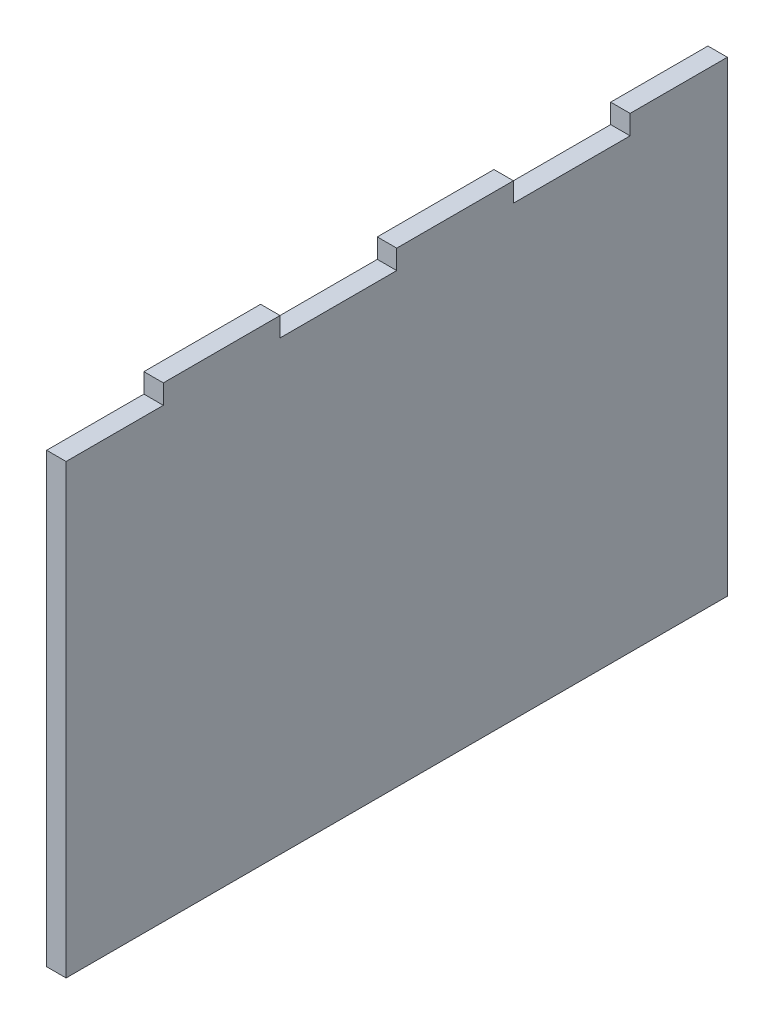
ISO-10303-21;
HEADER;
FILE_DESCRIPTION(('STEP AP214'),'2;1');
FILE_NAME('part.step','',(''),(''),'','','');
FILE_SCHEMA(('AUTOMOTIVE_DESIGN { 1 0 10303 214 1 1 1 1 }'));
ENDSEC;
DATA;
#1=APPLICATION_CONTEXT('core data for automotive mechanical design processes');
#2=APPLICATION_PROTOCOL_DEFINITION('international standard','automotive_design',2000,#1);
#3=PRODUCT_CONTEXT('',#1,'mechanical');
#4=PRODUCT('Part','Part','',(#3));
#5=PRODUCT_RELATED_PRODUCT_CATEGORY('part','',(#4));
#6=PRODUCT_DEFINITION_FORMATION('','',#4);
#7=PRODUCT_DEFINITION_CONTEXT('part definition',#1,'design');
#8=PRODUCT_DEFINITION('design','',#6,#7);
#9=PRODUCT_DEFINITION_SHAPE('','',#8);
#10=(LENGTH_UNIT() NAMED_UNIT(*) SI_UNIT(.MILLI.,.METRE.));
#11=(NAMED_UNIT(*) PLANE_ANGLE_UNIT() SI_UNIT($,.RADIAN.));
#12=(NAMED_UNIT(*) SI_UNIT($,.STERADIAN.) SOLID_ANGLE_UNIT());
#13=UNCERTAINTY_MEASURE_WITH_UNIT(LENGTH_MEASURE(1.E-05),#10,'distance_accuracy_value','');
#14=(GEOMETRIC_REPRESENTATION_CONTEXT(3) GLOBAL_UNCERTAINTY_ASSIGNED_CONTEXT((#13)) GLOBAL_UNIT_ASSIGNED_CONTEXT((#10,
#11,#12)) REPRESENTATION_CONTEXT('',''));
#15=CARTESIAN_POINT('',(0.,0.,0.));
#16=DIRECTION('',(0.,0.,1.));
#17=DIRECTION('',(1.,0.,0.));
#18=AXIS2_PLACEMENT_3D('',#15,#16,#17);
#19=CARTESIAN_POINT('',(12.7,152.4,-215.9));
#20=DIRECTION('',(0.,-1.,0.));
#21=DIRECTION('',(0.,0.,-1.));
#22=AXIS2_PLACEMENT_3D('',#19,#20,#21);
#23=PLANE('',#22);
#24=DIRECTION('',(0.,0.,1.));
#25=VECTOR('',#24,1.);
#26=CARTESIAN_POINT('',(12.7,152.4,-215.9));
#27=LINE('',#26,#25);
#28=CARTESIAN_POINT('',(12.7,152.4,-76.2));
#29=VERTEX_POINT('',#28);
#30=CARTESIAN_POINT('',(12.7,152.4,0.));
#31=VERTEX_POINT('',#30);
#32=EDGE_CURVE('E228',#29,#31,#27,.T.);
#33=ORIENTED_EDGE('',*,*,#32,.F.);
#34=DIRECTION('',(1.,0.,0.));
#35=VECTOR('',#34,1.);
#36=CARTESIAN_POINT('',(0.,152.4,-76.2));
#37=LINE('',#36,#35);
#38=CARTESIAN_POINT('',(0.,152.4,-76.2));
#39=VERTEX_POINT('',#38);
#40=EDGE_CURVE('E164',#39,#29,#37,.T.);
#41=ORIENTED_EDGE('',*,*,#40,.F.);
#42=DIRECTION('',(0.,0.,1.));
#43=VECTOR('',#42,1.);
#44=CARTESIAN_POINT('',(0.,152.4,-215.9));
#45=LINE('',#44,#43);
#46=CARTESIAN_POINT('',(0.,152.4,0.));
#47=VERTEX_POINT('',#46);
#48=EDGE_CURVE('E155',#39,#47,#45,.T.);
#49=ORIENTED_EDGE('',*,*,#48,.T.);
#50=DIRECTION('',(1.,0.,0.));
#51=VECTOR('',#50,1.);
#52=CARTESIAN_POINT('',(0.,152.4,0.));
#53=LINE('',#52,#51);
#54=EDGE_CURVE('E190',#47,#31,#53,.T.);
#55=ORIENTED_EDGE('',*,*,#54,.T.);
#56=EDGE_LOOP('',(#33,#41,#49,#55));
#57=FACE_BOUND('',#56,.T.);
#58=ADVANCED_FACE('F33',(#57),#23,.F.);
#59=CARTESIAN_POINT('',(12.7,152.4,76.2));
#60=VERTEX_POINT('',#59);
#61=CARTESIAN_POINT('',(12.7,152.4,152.4));
#62=VERTEX_POINT('',#61);
#63=EDGE_CURVE('E224',#60,#62,#27,.T.);
#64=ORIENTED_EDGE('',*,*,#63,.F.);
#65=DIRECTION('',(1.,0.,0.));
#66=VECTOR('',#65,1.);
#67=CARTESIAN_POINT('',(0.,152.4,76.2));
#68=LINE('',#67,#66);
#69=CARTESIAN_POINT('',(0.,152.4,76.2));
#70=VERTEX_POINT('',#69);
#71=EDGE_CURVE('E187',#70,#60,#68,.T.);
#72=ORIENTED_EDGE('',*,*,#71,.F.);
#73=CARTESIAN_POINT('',(0.,152.4,152.4));
#74=VERTEX_POINT('',#73);
#75=EDGE_CURVE('E236',#70,#74,#45,.T.);
#76=ORIENTED_EDGE('',*,*,#75,.T.);
#77=DIRECTION('',(1.,0.,0.));
#78=VECTOR('',#77,1.);
#79=CARTESIAN_POINT('',(0.,152.4,152.4));
#80=LINE('',#79,#78);
#81=EDGE_CURVE('E211',#74,#62,#80,.T.);
#82=ORIENTED_EDGE('',*,*,#81,.T.);
#83=EDGE_LOOP('',(#64,#72,#76,#82));
#84=FACE_BOUND('',#83,.T.);
#85=ADVANCED_FACE('F270',(#84),#23,.F.);
#86=CARTESIAN_POINT('',(12.7,152.4,-215.9));
#87=DIRECTION('',(0.,0.,-1.));
#88=DIRECTION('',(0.,1.,0.));
#89=AXIS2_PLACEMENT_3D('',#86,#87,#88);
#90=PLANE('',#89);
#91=DIRECTION('',(0.,-1.,0.));
#92=VECTOR('',#91,1.);
#93=CARTESIAN_POINT('',(0.,152.4,-215.9));
#94=LINE('',#93,#92);
#95=CARTESIAN_POINT('',(0.,152.4,-215.9));
#96=VERTEX_POINT('',#95);
#97=CARTESIAN_POINT('',(0.,-152.4,-215.9));
#98=VERTEX_POINT('',#97);
#99=EDGE_CURVE('E210',#96,#98,#94,.T.);
#100=ORIENTED_EDGE('',*,*,#99,.F.);
#101=DIRECTION('',(-1.,0.,0.));
#102=VECTOR('',#101,1.);
#103=CARTESIAN_POINT('',(12.7,152.4,-215.9));
#104=LINE('',#103,#102);
#105=CARTESIAN_POINT('',(12.7,152.4,-215.9));
#106=VERTEX_POINT('',#105);
#107=EDGE_CURVE('E11',#106,#96,#104,.T.);
#108=ORIENTED_EDGE('',*,*,#107,.F.);
#109=DIRECTION('',(0.,-1.,0.));
#110=VECTOR('',#109,1.);
#111=CARTESIAN_POINT('',(12.7,152.4,-215.9));
#112=LINE('',#111,#110);
#113=CARTESIAN_POINT('',(12.7,-152.4,-215.9));
#114=VERTEX_POINT('',#113);
#115=EDGE_CURVE('E215',#106,#114,#112,.T.);
#116=ORIENTED_EDGE('',*,*,#115,.T.);
#117=DIRECTION('',(-1.,0.,0.));
#118=VECTOR('',#117,1.);
#119=CARTESIAN_POINT('',(12.7,-152.4,-215.9));
#120=LINE('',#119,#118);
#121=EDGE_CURVE('E37',#114,#98,#120,.T.);
#122=ORIENTED_EDGE('',*,*,#121,.T.);
#123=EDGE_LOOP('',(#100,#108,#116,#122));
#124=FACE_BOUND('',#123,.T.);
#125=ADVANCED_FACE('F35',(#124),#90,.T.);
#126=CARTESIAN_POINT('',(0.,152.4,-152.4));
#127=VERTEX_POINT('',#126);
#128=EDGE_CURVE('E219',#96,#127,#45,.T.);
#129=ORIENTED_EDGE('',*,*,#128,.T.);
#130=DIRECTION('',(1.,0.,0.));
#131=VECTOR('',#130,1.);
#132=CARTESIAN_POINT('',(0.,152.4,-152.4));
#133=LINE('',#132,#131);
#134=CARTESIAN_POINT('',(12.7,152.4,-152.4));
#135=VERTEX_POINT('',#134);
#136=EDGE_CURVE('E167',#127,#135,#133,.T.);
#137=ORIENTED_EDGE('',*,*,#136,.T.);
#138=EDGE_CURVE('E225',#106,#135,#27,.T.);
#139=ORIENTED_EDGE('',*,*,#138,.F.);
#140=ORIENTED_EDGE('',*,*,#107,.T.);
#141=EDGE_LOOP('',(#129,#137,#139,#140));
#142=FACE_BOUND('',#141,.T.);
#143=ADVANCED_FACE('F250',(#142),#23,.F.);
#144=CARTESIAN_POINT('',(12.7,152.4,215.9));
#145=DIRECTION('',(0.,0.,-1.));
#146=DIRECTION('',(0.,1.,0.));
#147=AXIS2_PLACEMENT_3D('',#144,#145,#146);
#148=PLANE('',#147);
#149=DIRECTION('',(0.,-1.,0.));
#150=VECTOR('',#149,1.);
#151=CARTESIAN_POINT('',(12.7,152.4,215.9));
#152=LINE('',#151,#150);
#153=CARTESIAN_POINT('',(12.7,139.7,215.9));
#154=VERTEX_POINT('',#153);
#155=CARTESIAN_POINT('',(12.7,-152.4,215.9));
#156=VERTEX_POINT('',#155);
#157=EDGE_CURVE('E222',#154,#156,#152,.T.);
#158=ORIENTED_EDGE('',*,*,#157,.F.);
#159=DIRECTION('',(1.,0.,0.));
#160=VECTOR('',#159,1.);
#161=CARTESIAN_POINT('',(0.,139.7,215.9));
#162=LINE('',#161,#160);
#163=CARTESIAN_POINT('',(0.,139.7,215.9));
#164=VERTEX_POINT('',#163);
#165=EDGE_CURVE('E208',#164,#154,#162,.T.);
#166=ORIENTED_EDGE('',*,*,#165,.F.);
#167=DIRECTION('',(0.,-1.,0.));
#168=VECTOR('',#167,1.);
#169=CARTESIAN_POINT('',(0.,152.4,215.9));
#170=LINE('',#169,#168);
#171=CARTESIAN_POINT('',(0.,-152.4,215.9));
#172=VERTEX_POINT('',#171);
#173=EDGE_CURVE('E234',#164,#172,#170,.T.);
#174=ORIENTED_EDGE('',*,*,#173,.T.);
#175=DIRECTION('',(-1.,0.,0.));
#176=VECTOR('',#175,1.);
#177=CARTESIAN_POINT('',(12.7,-152.4,215.9));
#178=LINE('',#177,#176);
#179=EDGE_CURVE('E42',#156,#172,#178,.T.);
#180=ORIENTED_EDGE('',*,*,#179,.F.);
#181=EDGE_LOOP('',(#158,#166,#174,#180));
#182=FACE_BOUND('',#181,.T.);
#183=ADVANCED_FACE('F260',(#182),#148,.F.);
#184=CARTESIAN_POINT('',(12.7,-152.4,-215.9));
#185=DIRECTION('',(0.,-1.,0.));
#186=DIRECTION('',(0.,0.,-1.));
#187=AXIS2_PLACEMENT_3D('',#184,#185,#186);
#188=PLANE('',#187);
#189=DIRECTION('',(0.,0.,1.));
#190=VECTOR('',#189,1.);
#191=CARTESIAN_POINT('',(0.,-152.4,-215.9));
#192=LINE('',#191,#190);
#193=EDGE_CURVE('E231',#98,#172,#192,.T.);
#194=ORIENTED_EDGE('',*,*,#193,.F.);
#195=ORIENTED_EDGE('',*,*,#121,.F.);
#196=DIRECTION('',(0.,0.,1.));
#197=VECTOR('',#196,1.);
#198=CARTESIAN_POINT('',(12.7,-152.4,-215.9));
#199=LINE('',#198,#197);
#200=EDGE_CURVE('E218',#114,#156,#199,.T.);
#201=ORIENTED_EDGE('',*,*,#200,.T.);
#202=ORIENTED_EDGE('',*,*,#179,.T.);
#203=EDGE_LOOP('',(#194,#195,#201,#202));
#204=FACE_BOUND('',#203,.T.);
#205=ADVANCED_FACE('F246',(#204),#188,.T.);
#206=CARTESIAN_POINT('',(12.7,0.,0.));
#207=DIRECTION('',(-1.,0.,0.));
#208=DIRECTION('',(0.,0.,1.));
#209=AXIS2_PLACEMENT_3D('',#206,#207,#208);
#210=PLANE('',#209);
#211=DIRECTION('',(0.,0.,-1.));
#212=VECTOR('',#211,1.);
#213=CARTESIAN_POINT('',(12.7,139.7,-76.2));
#214=LINE('',#213,#212);
#215=CARTESIAN_POINT('',(12.7,139.7,-76.2));
#216=VERTEX_POINT('',#215);
#217=CARTESIAN_POINT('',(12.7,139.7,-152.4));
#218=VERTEX_POINT('',#217);
#219=EDGE_CURVE('E158',#216,#218,#214,.T.);
#220=ORIENTED_EDGE('',*,*,#219,.F.);
#221=DIRECTION('',(0.,-1.,0.));
#222=VECTOR('',#221,1.);
#223=CARTESIAN_POINT('',(12.7,152.4,-76.2));
#224=LINE('',#223,#222);
#225=EDGE_CURVE('E142',#29,#216,#224,.T.);
#226=ORIENTED_EDGE('',*,*,#225,.F.);
#227=ORIENTED_EDGE('',*,*,#32,.T.);
#228=DIRECTION('',(0.,1.,0.));
#229=VECTOR('',#228,1.);
#230=CARTESIAN_POINT('',(12.7,152.4,0.));
#231=LINE('',#230,#229);
#232=CARTESIAN_POINT('',(12.7,139.7,0.));
#233=VERTEX_POINT('',#232);
#234=EDGE_CURVE('E175',#233,#31,#231,.T.);
#235=ORIENTED_EDGE('',*,*,#234,.F.);
#236=DIRECTION('',(0.,0.,-1.));
#237=VECTOR('',#236,1.);
#238=CARTESIAN_POINT('',(12.7,139.7,76.2));
#239=LINE('',#238,#237);
#240=CARTESIAN_POINT('',(12.7,139.7,76.2));
#241=VERTEX_POINT('',#240);
#242=EDGE_CURVE('E182',#241,#233,#239,.T.);
#243=ORIENTED_EDGE('',*,*,#242,.F.);
#244=DIRECTION('',(0.,-1.,0.));
#245=VECTOR('',#244,1.);
#246=CARTESIAN_POINT('',(12.7,152.4,76.2));
#247=LINE('',#246,#245);
#248=EDGE_CURVE('E166',#60,#241,#247,.T.);
#249=ORIENTED_EDGE('',*,*,#248,.F.);
#250=ORIENTED_EDGE('',*,*,#63,.T.);
#251=DIRECTION('',(0.,1.,0.));
#252=VECTOR('',#251,1.);
#253=CARTESIAN_POINT('',(12.7,152.4,152.4));
#254=LINE('',#253,#252);
#255=CARTESIAN_POINT('',(12.7,139.7,152.4));
#256=VERTEX_POINT('',#255);
#257=EDGE_CURVE('E200',#256,#62,#254,.T.);
#258=ORIENTED_EDGE('',*,*,#257,.F.);
#259=DIRECTION('',(0.,0.,-1.));
#260=VECTOR('',#259,1.);
#261=CARTESIAN_POINT('',(12.7,139.7,215.9));
#262=LINE('',#261,#260);
#263=EDGE_CURVE('E189',#154,#256,#262,.T.);
#264=ORIENTED_EDGE('',*,*,#263,.F.);
#265=ORIENTED_EDGE('',*,*,#157,.T.);
#266=ORIENTED_EDGE('',*,*,#200,.F.);
#267=ORIENTED_EDGE('',*,*,#115,.F.);
#268=ORIENTED_EDGE('',*,*,#138,.T.);
#269=DIRECTION('',(0.,1.,0.));
#270=VECTOR('',#269,1.);
#271=CARTESIAN_POINT('',(12.7,152.4,-152.4));
#272=LINE('',#271,#270);
#273=EDGE_CURVE('E156',#218,#135,#272,.T.);
#274=ORIENTED_EDGE('',*,*,#273,.F.);
#275=EDGE_LOOP('',(#220,#226,#227,#235,#243,#249,#250,#258,#264,#265,#266,#267,#268,#274));
#276=FACE_BOUND('',#275,.T.);
#277=ADVANCED_FACE('F254',(#276),#210,.F.);
#278=CARTESIAN_POINT('',(0.,0.,0.));
#279=DIRECTION('',(-1.,0.,0.));
#280=DIRECTION('',(0.,0.,1.));
#281=AXIS2_PLACEMENT_3D('',#278,#279,#280);
#282=PLANE('',#281);
#283=DIRECTION('',(0.,-1.,0.));
#284=VECTOR('',#283,1.);
#285=CARTESIAN_POINT('',(0.,152.4,-76.2));
#286=LINE('',#285,#284);
#287=CARTESIAN_POINT('',(0.,139.7,-76.2));
#288=VERTEX_POINT('',#287);
#289=EDGE_CURVE('E139',#39,#288,#286,.T.);
#290=ORIENTED_EDGE('',*,*,#289,.T.);
#291=DIRECTION('',(0.,0.,-1.));
#292=VECTOR('',#291,1.);
#293=CARTESIAN_POINT('',(0.,139.7,-76.2));
#294=LINE('',#293,#292);
#295=CARTESIAN_POINT('',(0.,139.7,-152.4));
#296=VERTEX_POINT('',#295);
#297=EDGE_CURVE('E149',#288,#296,#294,.T.);
#298=ORIENTED_EDGE('',*,*,#297,.T.);
#299=DIRECTION('',(0.,1.,0.));
#300=VECTOR('',#299,1.);
#301=CARTESIAN_POINT('',(0.,152.4,-152.4));
#302=LINE('',#301,#300);
#303=EDGE_CURVE('E50',#296,#127,#302,.T.);
#304=ORIENTED_EDGE('',*,*,#303,.T.);
#305=ORIENTED_EDGE('',*,*,#128,.F.);
#306=ORIENTED_EDGE('',*,*,#99,.T.);
#307=ORIENTED_EDGE('',*,*,#193,.T.);
#308=ORIENTED_EDGE('',*,*,#173,.F.);
#309=DIRECTION('',(0.,0.,-1.));
#310=VECTOR('',#309,1.);
#311=CARTESIAN_POINT('',(0.,139.7,215.9));
#312=LINE('',#311,#310);
#313=CARTESIAN_POINT('',(0.,139.7,152.4));
#314=VERTEX_POINT('',#313);
#315=EDGE_CURVE('E196',#164,#314,#312,.T.);
#316=ORIENTED_EDGE('',*,*,#315,.T.);
#317=DIRECTION('',(0.,1.,0.));
#318=VECTOR('',#317,1.);
#319=CARTESIAN_POINT('',(0.,152.4,152.4));
#320=LINE('',#319,#318);
#321=EDGE_CURVE('E199',#314,#74,#320,.T.);
#322=ORIENTED_EDGE('',*,*,#321,.T.);
#323=ORIENTED_EDGE('',*,*,#75,.F.);
#324=DIRECTION('',(0.,-1.,0.));
#325=VECTOR('',#324,1.);
#326=CARTESIAN_POINT('',(0.,152.4,76.2));
#327=LINE('',#326,#325);
#328=CARTESIAN_POINT('',(0.,139.7,76.2));
#329=VERTEX_POINT('',#328);
#330=EDGE_CURVE('E171',#70,#329,#327,.T.);
#331=ORIENTED_EDGE('',*,*,#330,.T.);
#332=DIRECTION('',(0.,0.,-1.));
#333=VECTOR('',#332,1.);
#334=CARTESIAN_POINT('',(0.,139.7,76.2));
#335=LINE('',#334,#333);
#336=CARTESIAN_POINT('',(0.,139.7,0.));
#337=VERTEX_POINT('',#336);
#338=EDGE_CURVE('E174',#329,#337,#335,.T.);
#339=ORIENTED_EDGE('',*,*,#338,.T.);
#340=DIRECTION('',(0.,1.,0.));
#341=VECTOR('',#340,1.);
#342=CARTESIAN_POINT('',(0.,152.4,0.));
#343=LINE('',#342,#341);
#344=EDGE_CURVE('E58',#337,#47,#343,.T.);
#345=ORIENTED_EDGE('',*,*,#344,.T.);
#346=ORIENTED_EDGE('',*,*,#48,.F.);
#347=EDGE_LOOP('',(#290,#298,#304,#305,#306,#307,#308,#316,#322,#323,#331,#339,#345,#346));
#348=FACE_BOUND('',#347,.T.);
#349=ADVANCED_FACE('F154',(#348),#282,.T.);
#350=CARTESIAN_POINT('',(0.,139.7,215.9));
#351=DIRECTION('',(0.,-1.,0.));
#352=DIRECTION('',(0.,0.,-1.));
#353=AXIS2_PLACEMENT_3D('',#350,#351,#352);
#354=PLANE('',#353);
#355=ORIENTED_EDGE('',*,*,#263,.T.);
#356=DIRECTION('',(1.,0.,0.));
#357=VECTOR('',#356,1.);
#358=CARTESIAN_POINT('',(0.,139.7,152.4));
#359=LINE('',#358,#357);
#360=EDGE_CURVE('E203',#314,#256,#359,.T.);
#361=ORIENTED_EDGE('',*,*,#360,.F.);
#362=ORIENTED_EDGE('',*,*,#315,.F.);
#363=ORIENTED_EDGE('',*,*,#165,.T.);
#364=EDGE_LOOP('',(#355,#361,#362,#363));
#365=FACE_BOUND('',#364,.T.);
#366=ADVANCED_FACE('F264',(#365),#354,.F.);
#367=CARTESIAN_POINT('',(0.,152.4,152.4));
#368=DIRECTION('',(0.,0.,-1.));
#369=DIRECTION('',(-1.,0.,0.));
#370=AXIS2_PLACEMENT_3D('',#367,#368,#369);
#371=PLANE('',#370);
#372=ORIENTED_EDGE('',*,*,#257,.T.);
#373=ORIENTED_EDGE('',*,*,#81,.F.);
#374=ORIENTED_EDGE('',*,*,#321,.F.);
#375=ORIENTED_EDGE('',*,*,#360,.T.);
#376=EDGE_LOOP('',(#372,#373,#374,#375));
#377=FACE_BOUND('',#376,.T.);
#378=ADVANCED_FACE('F267',(#377),#371,.F.);
#379=CARTESIAN_POINT('',(0.,152.4,76.2));
#380=DIRECTION('',(0.,0.,1.));
#381=DIRECTION('',(0.,-1.,0.));
#382=AXIS2_PLACEMENT_3D('',#379,#380,#381);
#383=PLANE('',#382);
#384=ORIENTED_EDGE('',*,*,#248,.T.);
#385=DIRECTION('',(1.,0.,0.));
#386=VECTOR('',#385,1.);
#387=CARTESIAN_POINT('',(0.,139.7,76.2));
#388=LINE('',#387,#386);
#389=EDGE_CURVE('E179',#329,#241,#388,.T.);
#390=ORIENTED_EDGE('',*,*,#389,.F.);
#391=ORIENTED_EDGE('',*,*,#330,.F.);
#392=ORIENTED_EDGE('',*,*,#71,.T.);
#393=EDGE_LOOP('',(#384,#390,#391,#392));
#394=FACE_BOUND('',#393,.T.);
#395=ADVANCED_FACE('F282',(#394),#383,.F.);
#396=CARTESIAN_POINT('',(0.,152.4,0.));
#397=DIRECTION('',(0.,0.,-1.));
#398=DIRECTION('',(-1.,0.,0.));
#399=AXIS2_PLACEMENT_3D('',#396,#397,#398);
#400=PLANE('',#399);
#401=ORIENTED_EDGE('',*,*,#234,.T.);
#402=ORIENTED_EDGE('',*,*,#54,.F.);
#403=ORIENTED_EDGE('',*,*,#344,.F.);
#404=DIRECTION('',(1.,0.,0.));
#405=VECTOR('',#404,1.);
#406=CARTESIAN_POINT('',(0.,139.7,0.));
#407=LINE('',#406,#405);
#408=EDGE_CURVE('E193',#337,#233,#407,.T.);
#409=ORIENTED_EDGE('',*,*,#408,.T.);
#410=EDGE_LOOP('',(#401,#402,#403,#409));
#411=FACE_BOUND('',#410,.T.);
#412=ADVANCED_FACE('F274',(#411),#400,.F.);
#413=CARTESIAN_POINT('',(0.,139.7,76.2));
#414=DIRECTION('',(0.,-1.,0.));
#415=DIRECTION('',(0.,0.,-1.));
#416=AXIS2_PLACEMENT_3D('',#413,#414,#415);
#417=PLANE('',#416);
#418=ORIENTED_EDGE('',*,*,#242,.T.);
#419=ORIENTED_EDGE('',*,*,#408,.F.);
#420=ORIENTED_EDGE('',*,*,#338,.F.);
#421=ORIENTED_EDGE('',*,*,#389,.T.);
#422=EDGE_LOOP('',(#418,#419,#420,#421));
#423=FACE_BOUND('',#422,.T.);
#424=ADVANCED_FACE('F278',(#423),#417,.F.);
#425=CARTESIAN_POINT('',(0.,152.4,-76.2));
#426=DIRECTION('',(0.,0.,1.));
#427=DIRECTION('',(1.,0.,0.));
#428=AXIS2_PLACEMENT_3D('',#425,#426,#427);
#429=PLANE('',#428);
#430=ORIENTED_EDGE('',*,*,#225,.T.);
#431=DIRECTION('',(1.,0.,0.));
#432=VECTOR('',#431,1.);
#433=CARTESIAN_POINT('',(0.,139.7,-76.2));
#434=LINE('',#433,#432);
#435=EDGE_CURVE('E135',#288,#216,#434,.T.);
#436=ORIENTED_EDGE('',*,*,#435,.F.);
#437=ORIENTED_EDGE('',*,*,#289,.F.);
#438=ORIENTED_EDGE('',*,*,#40,.T.);
#439=EDGE_LOOP('',(#430,#436,#437,#438));
#440=FACE_BOUND('',#439,.T.);
#441=ADVANCED_FACE('F137',(#440),#429,.F.);
#442=CARTESIAN_POINT('',(0.,152.4,-152.4));
#443=DIRECTION('',(0.,0.,-1.));
#444=DIRECTION('',(-1.,0.,0.));
#445=AXIS2_PLACEMENT_3D('',#442,#443,#444);
#446=PLANE('',#445);
#447=ORIENTED_EDGE('',*,*,#273,.T.);
#448=ORIENTED_EDGE('',*,*,#136,.F.);
#449=ORIENTED_EDGE('',*,*,#303,.F.);
#450=DIRECTION('',(1.,0.,0.));
#451=VECTOR('',#450,1.);
#452=CARTESIAN_POINT('',(0.,139.7,-152.4));
#453=LINE('',#452,#451);
#454=EDGE_CURVE('E146',#296,#218,#453,.T.);
#455=ORIENTED_EDGE('',*,*,#454,.T.);
#456=EDGE_LOOP('',(#447,#448,#449,#455));
#457=FACE_BOUND('',#456,.T.);
#458=ADVANCED_FACE('F381',(#457),#446,.F.);
#459=CARTESIAN_POINT('',(0.,139.7,-76.2));
#460=DIRECTION('',(0.,-1.,0.));
#461=DIRECTION('',(0.,0.,-1.));
#462=AXIS2_PLACEMENT_3D('',#459,#460,#461);
#463=PLANE('',#462);
#464=ORIENTED_EDGE('',*,*,#219,.T.);
#465=ORIENTED_EDGE('',*,*,#454,.F.);
#466=ORIENTED_EDGE('',*,*,#297,.F.);
#467=ORIENTED_EDGE('',*,*,#435,.T.);
#468=EDGE_LOOP('',(#464,#465,#466,#467));
#469=FACE_BOUND('',#468,.T.);
#470=ADVANCED_FACE('F150',(#469),#463,.F.);
#471=CLOSED_SHELL('',(#58,#85,#125,#143,#183,#205,#277,#349,#366,#378,#395,#412,#424,#441,#458,#470));
#472=MANIFOLD_SOLID_BREP('B2',#471);
#473=ADVANCED_BREP_SHAPE_REPRESENTATION('',(#18,#472),#14);
#474=SHAPE_DEFINITION_REPRESENTATION(#9,#473);
ENDSEC;
END-ISO-10303-21;
